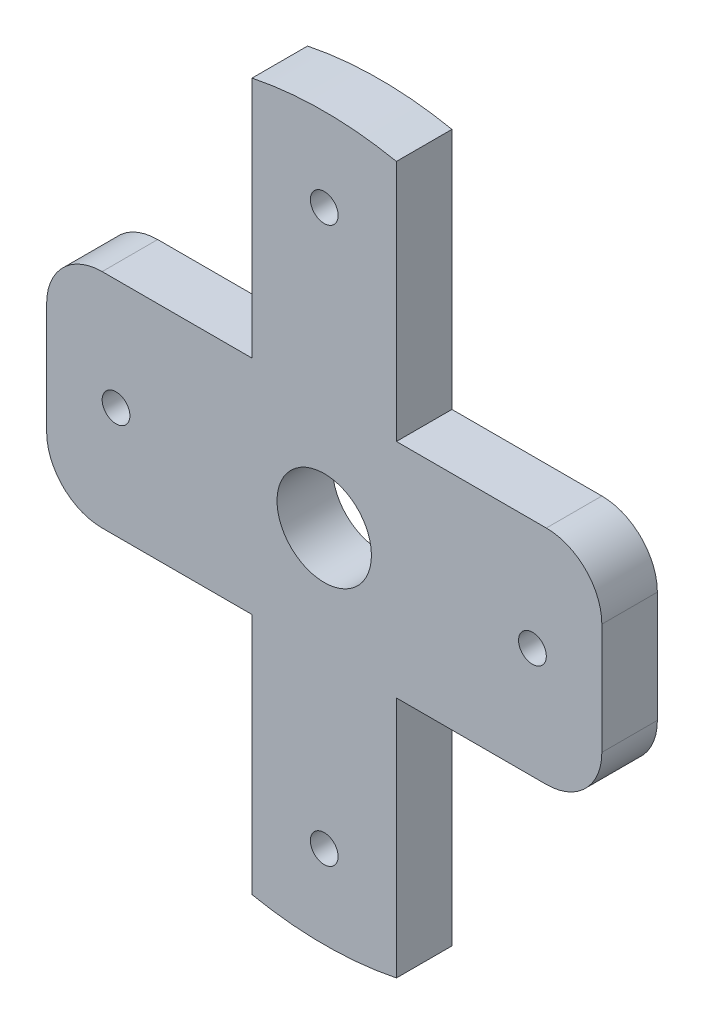
ISO-10303-21;
HEADER;
FILE_DESCRIPTION(('STEP AP214'),'2;1');
FILE_NAME('part.step','',(''),(''),'','','');
FILE_SCHEMA(('AUTOMOTIVE_DESIGN { 1 0 10303 214 1 1 1 1 }'));
ENDSEC;
DATA;
#1=APPLICATION_CONTEXT('core data for automotive mechanical design processes');
#2=APPLICATION_PROTOCOL_DEFINITION('international standard','automotive_design',2000,#1);
#3=PRODUCT_CONTEXT('',#1,'mechanical');
#4=PRODUCT('Part','Part','',(#3));
#5=PRODUCT_RELATED_PRODUCT_CATEGORY('part','',(#4));
#6=PRODUCT_DEFINITION_FORMATION('','',#4);
#7=PRODUCT_DEFINITION_CONTEXT('part definition',#1,'design');
#8=PRODUCT_DEFINITION('design','',#6,#7);
#9=PRODUCT_DEFINITION_SHAPE('','',#8);
#10=(LENGTH_UNIT() NAMED_UNIT(*) SI_UNIT(.MILLI.,.METRE.));
#11=(NAMED_UNIT(*) PLANE_ANGLE_UNIT() SI_UNIT($,.RADIAN.));
#12=(NAMED_UNIT(*) SI_UNIT($,.STERADIAN.) SOLID_ANGLE_UNIT());
#13=UNCERTAINTY_MEASURE_WITH_UNIT(LENGTH_MEASURE(1.E-05),#10,'distance_accuracy_value','');
#14=(GEOMETRIC_REPRESENTATION_CONTEXT(3) GLOBAL_UNCERTAINTY_ASSIGNED_CONTEXT((#13)) GLOBAL_UNIT_ASSIGNED_CONTEXT((#10,
#11,#12)) REPRESENTATION_CONTEXT('',''));
#15=CARTESIAN_POINT('',(0.,0.,0.));
#16=DIRECTION('',(0.,0.,1.));
#17=DIRECTION('',(1.,0.,0.));
#18=AXIS2_PLACEMENT_3D('',#15,#16,#17);
#19=CARTESIAN_POINT('',(0.,0.,10.));
#20=DIRECTION('',(0.,0.,1.));
#21=DIRECTION('',(1.,0.,0.));
#22=AXIS2_PLACEMENT_3D('',#19,#20,#21);
#23=PLANE('',#22);
#24=CARTESIAN_POINT('',(37.5,0.,10.));
#25=DIRECTION('',(0.,0.,1.));
#26=DIRECTION('',(1.,0.,0.));
#27=AXIS2_PLACEMENT_3D('',#24,#25,#26);
#28=CIRCLE('',#27,2.5);
#29=CARTESIAN_POINT('',(40.,0.,10.));
#30=VERTEX_POINT('',#29);
#31=EDGE_CURVE('E347',#30,#30,#28,.T.);
#32=ORIENTED_EDGE('',*,*,#31,.F.);
#33=EDGE_LOOP('',(#32));
#34=FACE_BOUND('',#33,.T.);
#35=CARTESIAN_POINT('',(0.,0.,10.));
#36=DIRECTION('',(0.,0.,1.));
#37=DIRECTION('',(1.,0.,0.));
#38=AXIS2_PLACEMENT_3D('',#35,#36,#37);
#39=CIRCLE('',#38,8.5);
#40=CARTESIAN_POINT('',(8.5,0.,10.));
#41=VERTEX_POINT('',#40);
#42=EDGE_CURVE('E359',#41,#41,#39,.T.);
#43=ORIENTED_EDGE('',*,*,#42,.F.);
#44=EDGE_LOOP('',(#43));
#45=FACE_BOUND('',#44,.T.);
#46=DIRECTION('',(0.,1.,0.));
#47=VECTOR('',#46,1.);
#48=CARTESIAN_POINT('',(13.,20.,10.));
#49=LINE('',#48,#47);
#50=CARTESIAN_POINT('',(13.,20.,10.));
#51=VERTEX_POINT('',#50);
#52=CARTESIAN_POINT('',(13.,63.6867333123626,10.));
#53=VERTEX_POINT('',#52);
#54=EDGE_CURVE('E209',#51,#53,#49,.T.);
#55=ORIENTED_EDGE('',*,*,#54,.T.);
#56=CARTESIAN_POINT('',(0.,0.,10.));
#57=DIRECTION('',(0.,0.,1.));
#58=DIRECTION('',(1.,0.,0.));
#59=AXIS2_PLACEMENT_3D('',#56,#57,#58);
#60=CIRCLE('',#59,65.);
#61=CARTESIAN_POINT('',(-13.,63.6867333123626,10.));
#62=VERTEX_POINT('',#61);
#63=EDGE_CURVE('E117',#53,#62,#60,.T.);
#64=ORIENTED_EDGE('',*,*,#63,.T.);
#65=DIRECTION('',(0.,-1.,0.));
#66=VECTOR('',#65,1.);
#67=CARTESIAN_POINT('',(-13.,20.,10.));
#68=LINE('',#67,#66);
#69=CARTESIAN_POINT('',(-13.,20.,10.));
#70=VERTEX_POINT('',#69);
#71=EDGE_CURVE('E248',#62,#70,#68,.T.);
#72=ORIENTED_EDGE('',*,*,#71,.T.);
#73=DIRECTION('',(-1.,0.,0.));
#74=VECTOR('',#73,1.);
#75=CARTESIAN_POINT('',(-13.,20.,10.));
#76=LINE('',#75,#74);
#77=CARTESIAN_POINT('',(-39.9999999999999,20.,10.));
#78=VERTEX_POINT('',#77);
#79=EDGE_CURVE('E267',#70,#78,#76,.T.);
#80=ORIENTED_EDGE('',*,*,#79,.T.);
#81=CARTESIAN_POINT('',(-40.,9.99999999999998,10.));
#82=DIRECTION('',(0.,0.,1.));
#83=DIRECTION('',(1.,0.,0.));
#84=AXIS2_PLACEMENT_3D('',#81,#82,#83);
#85=CIRCLE('',#84,10.);
#86=CARTESIAN_POINT('',(-50.,9.99999999999991,10.));
#87=VERTEX_POINT('',#86);
#88=EDGE_CURVE('E264',#78,#87,#85,.T.);
#89=ORIENTED_EDGE('',*,*,#88,.T.);
#90=DIRECTION('',(0.,-1.,0.));
#91=VECTOR('',#90,1.);
#92=CARTESIAN_POINT('',(-50.,9.99999999999991,10.));
#93=LINE('',#92,#91);
#94=CARTESIAN_POINT('',(-50.,-9.99999999999993,10.));
#95=VERTEX_POINT('',#94);
#96=EDGE_CURVE('E266',#87,#95,#93,.T.);
#97=ORIENTED_EDGE('',*,*,#96,.T.);
#98=CARTESIAN_POINT('',(-40.,-10.,10.));
#99=DIRECTION('',(0.,0.,1.));
#100=DIRECTION('',(1.,0.,0.));
#101=AXIS2_PLACEMENT_3D('',#98,#99,#100);
#102=CIRCLE('',#101,9.99999999999999);
#103=CARTESIAN_POINT('',(-39.9999999999999,-20.,10.));
#104=VERTEX_POINT('',#103);
#105=EDGE_CURVE('E269',#95,#104,#102,.T.);
#106=ORIENTED_EDGE('',*,*,#105,.T.);
#107=DIRECTION('',(1.,0.,0.));
#108=VECTOR('',#107,1.);
#109=CARTESIAN_POINT('',(-39.9999999999999,-20.,10.));
#110=LINE('',#109,#108);
#111=CARTESIAN_POINT('',(-13.,-20.,10.));
#112=VERTEX_POINT('',#111);
#113=EDGE_CURVE('E275',#104,#112,#110,.T.);
#114=ORIENTED_EDGE('',*,*,#113,.T.);
#115=DIRECTION('',(0.,-1.,0.));
#116=VECTOR('',#115,1.);
#117=CARTESIAN_POINT('',(-13.,-20.,10.));
#118=LINE('',#117,#116);
#119=CARTESIAN_POINT('',(-13.,-63.6867333123626,10.));
#120=VERTEX_POINT('',#119);
#121=EDGE_CURVE('E277',#112,#120,#118,.T.);
#122=ORIENTED_EDGE('',*,*,#121,.T.);
#123=CARTESIAN_POINT('',(0.,0.,10.));
#124=DIRECTION('',(0.,0.,1.));
#125=DIRECTION('',(1.,0.,0.));
#126=AXIS2_PLACEMENT_3D('',#123,#124,#125);
#127=CIRCLE('',#126,65.);
#128=CARTESIAN_POINT('',(13.,-63.6867333123626,10.));
#129=VERTEX_POINT('',#128);
#130=EDGE_CURVE('E279',#120,#129,#127,.T.);
#131=ORIENTED_EDGE('',*,*,#130,.T.);
#132=DIRECTION('',(0.,1.,0.));
#133=VECTOR('',#132,1.);
#134=CARTESIAN_POINT('',(13.,-20.,10.));
#135=LINE('',#134,#133);
#136=CARTESIAN_POINT('',(13.,-20.,10.));
#137=VERTEX_POINT('',#136);
#138=EDGE_CURVE('E281',#129,#137,#135,.T.);
#139=ORIENTED_EDGE('',*,*,#138,.T.);
#140=DIRECTION('',(1.,0.,0.));
#141=VECTOR('',#140,1.);
#142=CARTESIAN_POINT('',(13.,-20.,10.));
#143=LINE('',#142,#141);
#144=CARTESIAN_POINT('',(39.9999999999999,-20.,10.));
#145=VERTEX_POINT('',#144);
#146=EDGE_CURVE('E283',#137,#145,#143,.T.);
#147=ORIENTED_EDGE('',*,*,#146,.T.);
#148=CARTESIAN_POINT('',(40.,-9.99999999999999,10.));
#149=DIRECTION('',(0.,0.,1.));
#150=DIRECTION('',(-1.,0.,0.));
#151=AXIS2_PLACEMENT_3D('',#148,#149,#150);
#152=CIRCLE('',#151,10.);
#153=CARTESIAN_POINT('',(50.,-9.99999999999992,10.));
#154=VERTEX_POINT('',#153);
#155=EDGE_CURVE('E160',#145,#154,#152,.T.);
#156=ORIENTED_EDGE('',*,*,#155,.T.);
#157=DIRECTION('',(0.,1.,0.));
#158=VECTOR('',#157,1.);
#159=CARTESIAN_POINT('',(50.,9.99999999999992,10.));
#160=LINE('',#159,#158);
#161=CARTESIAN_POINT('',(50.,9.99999999999992,10.));
#162=VERTEX_POINT('',#161);
#163=EDGE_CURVE('E154',#154,#162,#160,.T.);
#164=ORIENTED_EDGE('',*,*,#163,.T.);
#165=CARTESIAN_POINT('',(40.,9.99999999999999,10.));
#166=DIRECTION('',(0.,0.,1.));
#167=DIRECTION('',(-1.,0.,0.));
#168=AXIS2_PLACEMENT_3D('',#165,#166,#167);
#169=CIRCLE('',#168,10.);
#170=CARTESIAN_POINT('',(39.9999999999999,20.,10.));
#171=VERTEX_POINT('',#170);
#172=EDGE_CURVE('E158',#162,#171,#169,.T.);
#173=ORIENTED_EDGE('',*,*,#172,.T.);
#174=DIRECTION('',(-1.,0.,0.));
#175=VECTOR('',#174,1.);
#176=CARTESIAN_POINT('',(13.,20.,10.));
#177=LINE('',#176,#175);
#178=EDGE_CURVE('E50',#171,#51,#177,.T.);
#179=ORIENTED_EDGE('',*,*,#178,.T.);
#180=EDGE_LOOP('',(#55,#64,#72,#80,#89,#97,#106,#114,#122,#131,#139,#147,#156,#164,#173,#179));
#181=FACE_BOUND('',#180,.T.);
#182=CARTESIAN_POINT('',(-37.5,0.,10.));
#183=DIRECTION('',(0.,0.,1.));
#184=DIRECTION('',(1.,0.,0.));
#185=AXIS2_PLACEMENT_3D('',#182,#183,#184);
#186=CIRCLE('',#185,2.5);
#187=CARTESIAN_POINT('',(-35.,0.,10.));
#188=VERTEX_POINT('',#187);
#189=EDGE_CURVE('E182',#188,#188,#186,.T.);
#190=ORIENTED_EDGE('',*,*,#189,.F.);
#191=EDGE_LOOP('',(#190));
#192=FACE_BOUND('',#191,.T.);
#193=CARTESIAN_POINT('',(0.,-50.,10.));
#194=DIRECTION('',(0.,0.,1.));
#195=DIRECTION('',(1.,0.,0.));
#196=AXIS2_PLACEMENT_3D('',#193,#194,#195);
#197=CIRCLE('',#196,2.5);
#198=CARTESIAN_POINT('',(2.50000000000001,-50.,10.));
#199=VERTEX_POINT('',#198);
#200=EDGE_CURVE('E353',#199,#199,#197,.T.);
#201=ORIENTED_EDGE('',*,*,#200,.F.);
#202=EDGE_LOOP('',(#201));
#203=FACE_BOUND('',#202,.T.);
#204=CARTESIAN_POINT('',(0.,50.,10.));
#205=DIRECTION('',(0.,0.,1.));
#206=DIRECTION('',(1.,0.,0.));
#207=AXIS2_PLACEMENT_3D('',#204,#205,#206);
#208=CIRCLE('',#207,2.5);
#209=CARTESIAN_POINT('',(2.5,50.,10.));
#210=VERTEX_POINT('',#209);
#211=EDGE_CURVE('E338',#210,#210,#208,.T.);
#212=ORIENTED_EDGE('',*,*,#211,.F.);
#213=EDGE_LOOP('',(#212));
#214=FACE_BOUND('',#213,.T.);
#215=ADVANCED_FACE('F33',(#34,#45,#181,#192,#203,#214),#23,.T.);
#216=CARTESIAN_POINT('',(0.,0.,0.));
#217=DIRECTION('',(0.,0.,1.));
#218=DIRECTION('',(1.,0.,0.));
#219=AXIS2_PLACEMENT_3D('',#216,#217,#218);
#220=PLANE('',#219);
#221=DIRECTION('',(0.,1.,0.));
#222=VECTOR('',#221,1.);
#223=CARTESIAN_POINT('',(13.,20.,0.));
#224=LINE('',#223,#222);
#225=CARTESIAN_POINT('',(13.,20.,0.));
#226=VERTEX_POINT('',#225);
#227=CARTESIAN_POINT('',(13.,63.6867333123626,0.));
#228=VERTEX_POINT('',#227);
#229=EDGE_CURVE('E178',#226,#228,#224,.T.);
#230=ORIENTED_EDGE('',*,*,#229,.F.);
#231=DIRECTION('',(-1.,0.,0.));
#232=VECTOR('',#231,1.);
#233=CARTESIAN_POINT('',(13.,20.,0.));
#234=LINE('',#233,#232);
#235=CARTESIAN_POINT('',(39.9999999999999,20.,0.));
#236=VERTEX_POINT('',#235);
#237=EDGE_CURVE('E109',#236,#226,#234,.T.);
#238=ORIENTED_EDGE('',*,*,#237,.F.);
#239=CARTESIAN_POINT('',(40.,9.99999999999999,0.));
#240=DIRECTION('',(0.,0.,1.));
#241=DIRECTION('',(-1.,0.,0.));
#242=AXIS2_PLACEMENT_3D('',#239,#240,#241);
#243=CIRCLE('',#242,10.);
#244=CARTESIAN_POINT('',(50.,9.99999999999992,0.));
#245=VERTEX_POINT('',#244);
#246=EDGE_CURVE('E103',#245,#236,#243,.T.);
#247=ORIENTED_EDGE('',*,*,#246,.F.);
#248=DIRECTION('',(0.,1.,0.));
#249=VECTOR('',#248,1.);
#250=CARTESIAN_POINT('',(50.,9.99999999999992,0.));
#251=LINE('',#250,#249);
#252=CARTESIAN_POINT('',(50.,-9.99999999999992,0.));
#253=VERTEX_POINT('',#252);
#254=EDGE_CURVE('E168',#253,#245,#251,.T.);
#255=ORIENTED_EDGE('',*,*,#254,.F.);
#256=CARTESIAN_POINT('',(40.,-9.99999999999999,0.));
#257=DIRECTION('',(0.,0.,1.));
#258=DIRECTION('',(-1.,0.,0.));
#259=AXIS2_PLACEMENT_3D('',#256,#257,#258);
#260=CIRCLE('',#259,10.);
#261=CARTESIAN_POINT('',(39.9999999999999,-20.,0.));
#262=VERTEX_POINT('',#261);
#263=EDGE_CURVE('E204',#262,#253,#260,.T.);
#264=ORIENTED_EDGE('',*,*,#263,.F.);
#265=DIRECTION('',(1.,0.,0.));
#266=VECTOR('',#265,1.);
#267=CARTESIAN_POINT('',(13.,-20.,0.));
#268=LINE('',#267,#266);
#269=CARTESIAN_POINT('',(13.,-20.,0.));
#270=VERTEX_POINT('',#269);
#271=EDGE_CURVE('E202',#270,#262,#268,.T.);
#272=ORIENTED_EDGE('',*,*,#271,.F.);
#273=DIRECTION('',(0.,1.,0.));
#274=VECTOR('',#273,1.);
#275=CARTESIAN_POINT('',(13.,-20.,0.));
#276=LINE('',#275,#274);
#277=CARTESIAN_POINT('',(13.,-63.6867333123626,0.));
#278=VERTEX_POINT('',#277);
#279=EDGE_CURVE('E200',#278,#270,#276,.T.);
#280=ORIENTED_EDGE('',*,*,#279,.F.);
#281=CARTESIAN_POINT('',(0.,0.,0.));
#282=DIRECTION('',(0.,0.,1.));
#283=DIRECTION('',(1.,0.,0.));
#284=AXIS2_PLACEMENT_3D('',#281,#282,#283);
#285=CIRCLE('',#284,65.);
#286=CARTESIAN_POINT('',(-13.,-63.6867333123626,0.));
#287=VERTEX_POINT('',#286);
#288=EDGE_CURVE('E198',#287,#278,#285,.T.);
#289=ORIENTED_EDGE('',*,*,#288,.F.);
#290=DIRECTION('',(0.,-1.,0.));
#291=VECTOR('',#290,1.);
#292=CARTESIAN_POINT('',(-13.,-20.,0.));
#293=LINE('',#292,#291);
#294=CARTESIAN_POINT('',(-13.,-20.,0.));
#295=VERTEX_POINT('',#294);
#296=EDGE_CURVE('E196',#295,#287,#293,.T.);
#297=ORIENTED_EDGE('',*,*,#296,.F.);
#298=DIRECTION('',(1.,0.,0.));
#299=VECTOR('',#298,1.);
#300=CARTESIAN_POINT('',(-39.9999999999999,-20.,0.));
#301=LINE('',#300,#299);
#302=CARTESIAN_POINT('',(-39.9999999999999,-20.,0.));
#303=VERTEX_POINT('',#302);
#304=EDGE_CURVE('E194',#303,#295,#301,.T.);
#305=ORIENTED_EDGE('',*,*,#304,.F.);
#306=CARTESIAN_POINT('',(-40.,-10.,0.));
#307=DIRECTION('',(0.,0.,1.));
#308=DIRECTION('',(1.,0.,0.));
#309=AXIS2_PLACEMENT_3D('',#306,#307,#308);
#310=CIRCLE('',#309,9.99999999999999);
#311=CARTESIAN_POINT('',(-50.,-9.99999999999993,0.));
#312=VERTEX_POINT('',#311);
#313=EDGE_CURVE('E192',#312,#303,#310,.T.);
#314=ORIENTED_EDGE('',*,*,#313,.F.);
#315=DIRECTION('',(0.,-1.,0.));
#316=VECTOR('',#315,1.);
#317=CARTESIAN_POINT('',(-50.,9.99999999999991,0.));
#318=LINE('',#317,#316);
#319=CARTESIAN_POINT('',(-50.,9.99999999999991,0.));
#320=VERTEX_POINT('',#319);
#321=EDGE_CURVE('E190',#320,#312,#318,.T.);
#322=ORIENTED_EDGE('',*,*,#321,.F.);
#323=CARTESIAN_POINT('',(-40.,9.99999999999998,0.));
#324=DIRECTION('',(0.,0.,1.));
#325=DIRECTION('',(1.,0.,0.));
#326=AXIS2_PLACEMENT_3D('',#323,#324,#325);
#327=CIRCLE('',#326,10.);
#328=CARTESIAN_POINT('',(-39.9999999999999,20.,0.));
#329=VERTEX_POINT('',#328);
#330=EDGE_CURVE('E188',#329,#320,#327,.T.);
#331=ORIENTED_EDGE('',*,*,#330,.F.);
#332=DIRECTION('',(-1.,0.,0.));
#333=VECTOR('',#332,1.);
#334=CARTESIAN_POINT('',(-13.,20.,0.));
#335=LINE('',#334,#333);
#336=CARTESIAN_POINT('',(-13.,20.,0.));
#337=VERTEX_POINT('',#336);
#338=EDGE_CURVE('E186',#337,#329,#335,.T.);
#339=ORIENTED_EDGE('',*,*,#338,.F.);
#340=DIRECTION('',(0.,-1.,0.));
#341=VECTOR('',#340,1.);
#342=CARTESIAN_POINT('',(-13.,20.,0.));
#343=LINE('',#342,#341);
#344=CARTESIAN_POINT('',(-13.,63.6867333123626,0.));
#345=VERTEX_POINT('',#344);
#346=EDGE_CURVE('E184',#345,#337,#343,.T.);
#347=ORIENTED_EDGE('',*,*,#346,.F.);
#348=CARTESIAN_POINT('',(0.,0.,0.));
#349=DIRECTION('',(0.,0.,1.));
#350=DIRECTION('',(1.,0.,0.));
#351=AXIS2_PLACEMENT_3D('',#348,#349,#350);
#352=CIRCLE('',#351,65.);
#353=EDGE_CURVE('E181',#228,#345,#352,.T.);
#354=ORIENTED_EDGE('',*,*,#353,.F.);
#355=EDGE_LOOP('',(#230,#238,#247,#255,#264,#272,#280,#289,#297,#305,#314,#322,#331,#339,#347,#354));
#356=FACE_BOUND('',#355,.T.);
#357=CARTESIAN_POINT('',(-37.5,0.,0.));
#358=DIRECTION('',(0.,0.,1.));
#359=DIRECTION('',(1.,0.,0.));
#360=AXIS2_PLACEMENT_3D('',#357,#358,#359);
#361=CIRCLE('',#360,2.5);
#362=CARTESIAN_POINT('',(-35.,0.,0.));
#363=VERTEX_POINT('',#362);
#364=EDGE_CURVE('E362',#363,#363,#361,.T.);
#365=ORIENTED_EDGE('',*,*,#364,.T.);
#366=EDGE_LOOP('',(#365));
#367=FACE_BOUND('',#366,.T.);
#368=CARTESIAN_POINT('',(0.,0.,0.));
#369=DIRECTION('',(0.,0.,1.));
#370=DIRECTION('',(1.,0.,0.));
#371=AXIS2_PLACEMENT_3D('',#368,#369,#370);
#372=CIRCLE('',#371,8.5);
#373=CARTESIAN_POINT('',(8.5,0.,0.));
#374=VERTEX_POINT('',#373);
#375=EDGE_CURVE('E356',#374,#374,#372,.T.);
#376=ORIENTED_EDGE('',*,*,#375,.T.);
#377=EDGE_LOOP('',(#376));
#378=FACE_BOUND('',#377,.T.);
#379=CARTESIAN_POINT('',(0.,-50.,0.));
#380=DIRECTION('',(0.,0.,1.));
#381=DIRECTION('',(1.,0.,0.));
#382=AXIS2_PLACEMENT_3D('',#379,#380,#381);
#383=CIRCLE('',#382,2.5);
#384=CARTESIAN_POINT('',(2.50000000000001,-50.,0.));
#385=VERTEX_POINT('',#384);
#386=EDGE_CURVE('E350',#385,#385,#383,.T.);
#387=ORIENTED_EDGE('',*,*,#386,.T.);
#388=EDGE_LOOP('',(#387));
#389=FACE_BOUND('',#388,.T.);
#390=CARTESIAN_POINT('',(37.5,0.,0.));
#391=DIRECTION('',(0.,0.,1.));
#392=DIRECTION('',(1.,0.,0.));
#393=AXIS2_PLACEMENT_3D('',#390,#391,#392);
#394=CIRCLE('',#393,2.5);
#395=CARTESIAN_POINT('',(40.,0.,0.));
#396=VERTEX_POINT('',#395);
#397=EDGE_CURVE('E344',#396,#396,#394,.T.);
#398=ORIENTED_EDGE('',*,*,#397,.T.);
#399=EDGE_LOOP('',(#398));
#400=FACE_BOUND('',#399,.T.);
#401=CARTESIAN_POINT('',(0.,50.,0.));
#402=DIRECTION('',(0.,0.,1.));
#403=DIRECTION('',(1.,0.,0.));
#404=AXIS2_PLACEMENT_3D('',#401,#402,#403);
#405=CIRCLE('',#404,2.5);
#406=CARTESIAN_POINT('',(2.5,50.,0.));
#407=VERTEX_POINT('',#406);
#408=EDGE_CURVE('E341',#407,#407,#405,.T.);
#409=ORIENTED_EDGE('',*,*,#408,.T.);
#410=EDGE_LOOP('',(#409));
#411=FACE_BOUND('',#410,.T.);
#412=ADVANCED_FACE('F252',(#356,#367,#378,#389,#400,#411),#220,.F.);
#413=CARTESIAN_POINT('',(13.,20.,10.));
#414=DIRECTION('',(-1.,0.,0.));
#415=DIRECTION('',(0.,0.,1.));
#416=AXIS2_PLACEMENT_3D('',#413,#414,#415);
#417=PLANE('',#416);
#418=ORIENTED_EDGE('',*,*,#229,.T.);
#419=DIRECTION('',(0.,0.,-1.));
#420=VECTOR('',#419,1.);
#421=CARTESIAN_POINT('',(13.,63.6867333123626,10.));
#422=LINE('',#421,#420);
#423=EDGE_CURVE('E11',#53,#228,#422,.T.);
#424=ORIENTED_EDGE('',*,*,#423,.F.);
#425=ORIENTED_EDGE('',*,*,#54,.F.);
#426=DIRECTION('',(0.,0.,-1.));
#427=VECTOR('',#426,1.);
#428=CARTESIAN_POINT('',(13.,20.,10.));
#429=LINE('',#428,#427);
#430=EDGE_CURVE('E174',#51,#226,#429,.T.);
#431=ORIENTED_EDGE('',*,*,#430,.T.);
#432=EDGE_LOOP('',(#418,#424,#425,#431));
#433=FACE_BOUND('',#432,.T.);
#434=ADVANCED_FACE('F35',(#433),#417,.F.);
#435=CARTESIAN_POINT('',(0.,0.,10.));
#436=DIRECTION('',(0.,0.,-1.));
#437=DIRECTION('',(-1.,0.,0.));
#438=AXIS2_PLACEMENT_3D('',#435,#436,#437);
#439=CYLINDRICAL_SURFACE('',#438,65.);
#440=ORIENTED_EDGE('',*,*,#353,.T.);
#441=DIRECTION('',(0.,0.,-1.));
#442=VECTOR('',#441,1.);
#443=CARTESIAN_POINT('',(-13.,63.6867333123626,10.));
#444=LINE('',#443,#442);
#445=EDGE_CURVE('E42',#62,#345,#444,.T.);
#446=ORIENTED_EDGE('',*,*,#445,.F.);
#447=ORIENTED_EDGE('',*,*,#63,.F.);
#448=ORIENTED_EDGE('',*,*,#423,.T.);
#449=EDGE_LOOP('',(#440,#446,#447,#448));
#450=FACE_BOUND('',#449,.T.);
#451=ADVANCED_FACE('F521',(#450),#439,.T.);
#452=CARTESIAN_POINT('',(-13.,20.,10.));
#453=DIRECTION('',(1.,0.,0.));
#454=DIRECTION('',(0.,0.,-1.));
#455=AXIS2_PLACEMENT_3D('',#452,#453,#454);
#456=PLANE('',#455);
#457=ORIENTED_EDGE('',*,*,#346,.T.);
#458=DIRECTION('',(0.,0.,-1.));
#459=VECTOR('',#458,1.);
#460=CARTESIAN_POINT('',(-13.,20.,10.));
#461=LINE('',#460,#459);
#462=EDGE_CURVE('E240',#70,#337,#461,.T.);
#463=ORIENTED_EDGE('',*,*,#462,.F.);
#464=ORIENTED_EDGE('',*,*,#71,.F.);
#465=ORIENTED_EDGE('',*,*,#445,.T.);
#466=EDGE_LOOP('',(#457,#463,#464,#465));
#467=FACE_BOUND('',#466,.T.);
#468=ADVANCED_FACE('F246',(#467),#456,.F.);
#469=CARTESIAN_POINT('',(-13.,20.,10.));
#470=DIRECTION('',(0.,-1.,0.));
#471=DIRECTION('',(1.,0.,0.));
#472=AXIS2_PLACEMENT_3D('',#469,#470,#471);
#473=PLANE('',#472);
#474=ORIENTED_EDGE('',*,*,#338,.T.);
#475=DIRECTION('',(0.,0.,-1.));
#476=VECTOR('',#475,1.);
#477=CARTESIAN_POINT('',(-39.9999999999999,20.,10.));
#478=LINE('',#477,#476);
#479=EDGE_CURVE('E237',#78,#329,#478,.T.);
#480=ORIENTED_EDGE('',*,*,#479,.F.);
#481=ORIENTED_EDGE('',*,*,#79,.F.);
#482=ORIENTED_EDGE('',*,*,#462,.T.);
#483=EDGE_LOOP('',(#474,#480,#481,#482));
#484=FACE_BOUND('',#483,.T.);
#485=ADVANCED_FACE('F258',(#484),#473,.F.);
#486=CARTESIAN_POINT('',(-40.,9.99999999999998,10.));
#487=DIRECTION('',(0.,0.,-1.));
#488=DIRECTION('',(-1.,0.,0.));
#489=AXIS2_PLACEMENT_3D('',#486,#487,#488);
#490=CYLINDRICAL_SURFACE('',#489,10.);
#491=ORIENTED_EDGE('',*,*,#330,.T.);
#492=DIRECTION('',(0.,0.,-1.));
#493=VECTOR('',#492,1.);
#494=CARTESIAN_POINT('',(-50.,9.99999999999991,10.));
#495=LINE('',#494,#493);
#496=EDGE_CURVE('E234',#87,#320,#495,.T.);
#497=ORIENTED_EDGE('',*,*,#496,.F.);
#498=ORIENTED_EDGE('',*,*,#88,.F.);
#499=ORIENTED_EDGE('',*,*,#479,.T.);
#500=EDGE_LOOP('',(#491,#497,#498,#499));
#501=FACE_BOUND('',#500,.T.);
#502=ADVANCED_FACE('F262',(#501),#490,.T.);
#503=CARTESIAN_POINT('',(-50.,9.99999999999991,10.));
#504=DIRECTION('',(1.,0.,0.));
#505=DIRECTION('',(0.,1.,0.));
#506=AXIS2_PLACEMENT_3D('',#503,#504,#505);
#507=PLANE('',#506);
#508=ORIENTED_EDGE('',*,*,#321,.T.);
#509=DIRECTION('',(0.,0.,-1.));
#510=VECTOR('',#509,1.);
#511=CARTESIAN_POINT('',(-50.,-9.99999999999993,10.));
#512=LINE('',#511,#510);
#513=EDGE_CURVE('E231',#95,#312,#512,.T.);
#514=ORIENTED_EDGE('',*,*,#513,.F.);
#515=ORIENTED_EDGE('',*,*,#96,.F.);
#516=ORIENTED_EDGE('',*,*,#496,.T.);
#517=EDGE_LOOP('',(#508,#514,#515,#516));
#518=FACE_BOUND('',#517,.T.);
#519=ADVANCED_FACE('F486',(#518),#507,.F.);
#520=CARTESIAN_POINT('',(-40.,-10.,10.));
#521=DIRECTION('',(0.,0.,-1.));
#522=DIRECTION('',(-1.,0.,0.));
#523=AXIS2_PLACEMENT_3D('',#520,#521,#522);
#524=CYLINDRICAL_SURFACE('',#523,9.99999999999999);
#525=ORIENTED_EDGE('',*,*,#313,.T.);
#526=DIRECTION('',(0.,0.,-1.));
#527=VECTOR('',#526,1.);
#528=CARTESIAN_POINT('',(-39.9999999999999,-20.,10.));
#529=LINE('',#528,#527);
#530=EDGE_CURVE('E228',#104,#303,#529,.T.);
#531=ORIENTED_EDGE('',*,*,#530,.F.);
#532=ORIENTED_EDGE('',*,*,#105,.F.);
#533=ORIENTED_EDGE('',*,*,#513,.T.);
#534=EDGE_LOOP('',(#525,#531,#532,#533));
#535=FACE_BOUND('',#534,.T.);
#536=ADVANCED_FACE('F476',(#535),#524,.T.);
#537=CARTESIAN_POINT('',(-39.9999999999999,-20.,10.));
#538=DIRECTION('',(0.,1.,0.));
#539=DIRECTION('',(-1.,0.,0.));
#540=AXIS2_PLACEMENT_3D('',#537,#538,#539);
#541=PLANE('',#540);
#542=ORIENTED_EDGE('',*,*,#304,.T.);
#543=DIRECTION('',(0.,0.,-1.));
#544=VECTOR('',#543,1.);
#545=CARTESIAN_POINT('',(-13.,-20.,10.));
#546=LINE('',#545,#544);
#547=EDGE_CURVE('E225',#112,#295,#546,.T.);
#548=ORIENTED_EDGE('',*,*,#547,.F.);
#549=ORIENTED_EDGE('',*,*,#113,.F.);
#550=ORIENTED_EDGE('',*,*,#530,.T.);
#551=EDGE_LOOP('',(#542,#548,#549,#550));
#552=FACE_BOUND('',#551,.T.);
#553=ADVANCED_FACE('F466',(#552),#541,.F.);
#554=CARTESIAN_POINT('',(-13.,-20.,10.));
#555=DIRECTION('',(1.,0.,0.));
#556=DIRECTION('',(0.,0.,-1.));
#557=AXIS2_PLACEMENT_3D('',#554,#555,#556);
#558=PLANE('',#557);
#559=ORIENTED_EDGE('',*,*,#296,.T.);
#560=DIRECTION('',(0.,0.,-1.));
#561=VECTOR('',#560,1.);
#562=CARTESIAN_POINT('',(-13.,-63.6867333123626,10.));
#563=LINE('',#562,#561);
#564=EDGE_CURVE('E222',#120,#287,#563,.T.);
#565=ORIENTED_EDGE('',*,*,#564,.F.);
#566=ORIENTED_EDGE('',*,*,#121,.F.);
#567=ORIENTED_EDGE('',*,*,#547,.T.);
#568=EDGE_LOOP('',(#559,#565,#566,#567));
#569=FACE_BOUND('',#568,.T.);
#570=ADVANCED_FACE('F456',(#569),#558,.F.);
#571=CARTESIAN_POINT('',(0.,0.,10.));
#572=DIRECTION('',(0.,0.,-1.));
#573=DIRECTION('',(-1.,0.,0.));
#574=AXIS2_PLACEMENT_3D('',#571,#572,#573);
#575=CYLINDRICAL_SURFACE('',#574,65.);
#576=ORIENTED_EDGE('',*,*,#288,.T.);
#577=DIRECTION('',(0.,0.,-1.));
#578=VECTOR('',#577,1.);
#579=CARTESIAN_POINT('',(13.,-63.6867333123626,10.));
#580=LINE('',#579,#578);
#581=EDGE_CURVE('E219',#129,#278,#580,.T.);
#582=ORIENTED_EDGE('',*,*,#581,.F.);
#583=ORIENTED_EDGE('',*,*,#130,.F.);
#584=ORIENTED_EDGE('',*,*,#564,.T.);
#585=EDGE_LOOP('',(#576,#582,#583,#584));
#586=FACE_BOUND('',#585,.T.);
#587=ADVANCED_FACE('F446',(#586),#575,.T.);
#588=CARTESIAN_POINT('',(13.,-20.,10.));
#589=DIRECTION('',(-1.,0.,0.));
#590=DIRECTION('',(0.,0.,1.));
#591=AXIS2_PLACEMENT_3D('',#588,#589,#590);
#592=PLANE('',#591);
#593=ORIENTED_EDGE('',*,*,#279,.T.);
#594=DIRECTION('',(0.,0.,-1.));
#595=VECTOR('',#594,1.);
#596=CARTESIAN_POINT('',(13.,-20.,10.));
#597=LINE('',#596,#595);
#598=EDGE_CURVE('E216',#137,#270,#597,.T.);
#599=ORIENTED_EDGE('',*,*,#598,.F.);
#600=ORIENTED_EDGE('',*,*,#138,.F.);
#601=ORIENTED_EDGE('',*,*,#581,.T.);
#602=EDGE_LOOP('',(#593,#599,#600,#601));
#603=FACE_BOUND('',#602,.T.);
#604=ADVANCED_FACE('F437',(#603),#592,.F.);
#605=CARTESIAN_POINT('',(13.,-20.,10.));
#606=DIRECTION('',(0.,1.,0.));
#607=DIRECTION('',(0.,0.,1.));
#608=AXIS2_PLACEMENT_3D('',#605,#606,#607);
#609=PLANE('',#608);
#610=ORIENTED_EDGE('',*,*,#271,.T.);
#611=DIRECTION('',(0.,0.,-1.));
#612=VECTOR('',#611,1.);
#613=CARTESIAN_POINT('',(39.9999999999999,-20.,10.));
#614=LINE('',#613,#612);
#615=EDGE_CURVE('E213',#145,#262,#614,.T.);
#616=ORIENTED_EDGE('',*,*,#615,.F.);
#617=ORIENTED_EDGE('',*,*,#146,.F.);
#618=ORIENTED_EDGE('',*,*,#598,.T.);
#619=EDGE_LOOP('',(#610,#616,#617,#618));
#620=FACE_BOUND('',#619,.T.);
#621=ADVANCED_FACE('F289',(#620),#609,.F.);
#622=CARTESIAN_POINT('',(40.,-9.99999999999999,10.));
#623=DIRECTION('',(0.,0.,-1.));
#624=DIRECTION('',(-1.,0.,0.));
#625=AXIS2_PLACEMENT_3D('',#622,#623,#624);
#626=CYLINDRICAL_SURFACE('',#625,10.);
#627=ORIENTED_EDGE('',*,*,#263,.T.);
#628=DIRECTION('',(0.,0.,-1.));
#629=VECTOR('',#628,1.);
#630=CARTESIAN_POINT('',(50.,-9.99999999999992,10.));
#631=LINE('',#630,#629);
#632=EDGE_CURVE('E169',#154,#253,#631,.T.);
#633=ORIENTED_EDGE('',*,*,#632,.F.);
#634=ORIENTED_EDGE('',*,*,#155,.F.);
#635=ORIENTED_EDGE('',*,*,#615,.T.);
#636=EDGE_LOOP('',(#627,#633,#634,#635));
#637=FACE_BOUND('',#636,.T.);
#638=ADVANCED_FACE('F293',(#637),#626,.T.);
#639=CARTESIAN_POINT('',(50.,9.99999999999992,10.));
#640=DIRECTION('',(-1.,0.,0.));
#641=DIRECTION('',(0.,0.,1.));
#642=AXIS2_PLACEMENT_3D('',#639,#640,#641);
#643=PLANE('',#642);
#644=ORIENTED_EDGE('',*,*,#254,.T.);
#645=DIRECTION('',(0.,0.,-1.));
#646=VECTOR('',#645,1.);
#647=CARTESIAN_POINT('',(50.,9.99999999999992,10.));
#648=LINE('',#647,#646);
#649=EDGE_CURVE('E165',#162,#245,#648,.T.);
#650=ORIENTED_EDGE('',*,*,#649,.F.);
#651=ORIENTED_EDGE('',*,*,#163,.F.);
#652=ORIENTED_EDGE('',*,*,#632,.T.);
#653=EDGE_LOOP('',(#644,#650,#651,#652));
#654=FACE_BOUND('',#653,.T.);
#655=ADVANCED_FACE('F166',(#654),#643,.F.);
#656=CARTESIAN_POINT('',(40.,9.99999999999999,10.));
#657=DIRECTION('',(0.,0.,-1.));
#658=DIRECTION('',(-1.,0.,0.));
#659=AXIS2_PLACEMENT_3D('',#656,#657,#658);
#660=CYLINDRICAL_SURFACE('',#659,10.);
#661=ORIENTED_EDGE('',*,*,#246,.T.);
#662=DIRECTION('',(0.,0.,-1.));
#663=VECTOR('',#662,1.);
#664=CARTESIAN_POINT('',(39.9999999999999,20.,10.));
#665=LINE('',#664,#663);
#666=EDGE_CURVE('E170',#171,#236,#665,.T.);
#667=ORIENTED_EDGE('',*,*,#666,.F.);
#668=ORIENTED_EDGE('',*,*,#172,.F.);
#669=ORIENTED_EDGE('',*,*,#649,.T.);
#670=EDGE_LOOP('',(#661,#667,#668,#669));
#671=FACE_BOUND('',#670,.T.);
#672=ADVANCED_FACE('F172',(#671),#660,.T.);
#673=CARTESIAN_POINT('',(13.,20.,10.));
#674=DIRECTION('',(0.,-1.,0.));
#675=DIRECTION('',(0.,0.,-1.));
#676=AXIS2_PLACEMENT_3D('',#673,#674,#675);
#677=PLANE('',#676);
#678=ORIENTED_EDGE('',*,*,#237,.T.);
#679=ORIENTED_EDGE('',*,*,#430,.F.);
#680=ORIENTED_EDGE('',*,*,#178,.F.);
#681=ORIENTED_EDGE('',*,*,#666,.T.);
#682=EDGE_LOOP('',(#678,#679,#680,#681));
#683=FACE_BOUND('',#682,.T.);
#684=ADVANCED_FACE('F297',(#683),#677,.F.);
#685=CARTESIAN_POINT('',(-37.5,0.,10.));
#686=DIRECTION('',(0.,0.,-1.));
#687=DIRECTION('',(-1.,0.,0.));
#688=AXIS2_PLACEMENT_3D('',#685,#686,#687);
#689=CYLINDRICAL_SURFACE('',#688,2.5);
#690=ORIENTED_EDGE('',*,*,#189,.T.);
#691=EDGE_LOOP('',(#690));
#692=FACE_BOUND('',#691,.T.);
#693=ORIENTED_EDGE('',*,*,#364,.F.);
#694=EDGE_LOOP('',(#693));
#695=FACE_BOUND('',#694,.T.);
#696=ADVANCED_FACE('F299',(#692,#695),#689,.F.);
#697=CARTESIAN_POINT('',(0.,0.,10.));
#698=DIRECTION('',(0.,0.,-1.));
#699=DIRECTION('',(-1.,0.,0.));
#700=AXIS2_PLACEMENT_3D('',#697,#698,#699);
#701=CYLINDRICAL_SURFACE('',#700,8.5);
#702=ORIENTED_EDGE('',*,*,#42,.T.);
#703=EDGE_LOOP('',(#702));
#704=FACE_BOUND('',#703,.T.);
#705=ORIENTED_EDGE('',*,*,#375,.F.);
#706=EDGE_LOOP('',(#705));
#707=FACE_BOUND('',#706,.T.);
#708=ADVANCED_FACE('F305',(#704,#707),#701,.F.);
#709=CARTESIAN_POINT('',(0.,-50.,10.));
#710=DIRECTION('',(0.,0.,-1.));
#711=DIRECTION('',(-1.,0.,0.));
#712=AXIS2_PLACEMENT_3D('',#709,#710,#711);
#713=CYLINDRICAL_SURFACE('',#712,2.5);
#714=ORIENTED_EDGE('',*,*,#200,.T.);
#715=EDGE_LOOP('',(#714));
#716=FACE_BOUND('',#715,.T.);
#717=ORIENTED_EDGE('',*,*,#386,.F.);
#718=EDGE_LOOP('',(#717));
#719=FACE_BOUND('',#718,.T.);
#720=ADVANCED_FACE('F321',(#716,#719),#713,.F.);
#721=CARTESIAN_POINT('',(37.5,0.,10.));
#722=DIRECTION('',(0.,0.,-1.));
#723=DIRECTION('',(-1.,0.,0.));
#724=AXIS2_PLACEMENT_3D('',#721,#722,#723);
#725=CYLINDRICAL_SURFACE('',#724,2.5);
#726=ORIENTED_EDGE('',*,*,#31,.T.);
#727=EDGE_LOOP('',(#726));
#728=FACE_BOUND('',#727,.T.);
#729=ORIENTED_EDGE('',*,*,#397,.F.);
#730=EDGE_LOOP('',(#729));
#731=FACE_BOUND('',#730,.T.);
#732=ADVANCED_FACE('F325',(#728,#731),#725,.F.);
#733=CARTESIAN_POINT('',(0.,50.,10.));
#734=DIRECTION('',(0.,0.,-1.));
#735=DIRECTION('',(-1.,0.,0.));
#736=AXIS2_PLACEMENT_3D('',#733,#734,#735);
#737=CYLINDRICAL_SURFACE('',#736,2.5);
#738=ORIENTED_EDGE('',*,*,#211,.T.);
#739=EDGE_LOOP('',(#738));
#740=FACE_BOUND('',#739,.T.);
#741=ORIENTED_EDGE('',*,*,#408,.F.);
#742=EDGE_LOOP('',(#741));
#743=FACE_BOUND('',#742,.T.);
#744=ADVANCED_FACE('F329',(#740,#743),#737,.F.);
#745=CLOSED_SHELL('',(#215,#412,#434,#451,#468,#485,#502,#519,#536,#553,#570,#587,#604,#621,
#638,#655,#672,#684,#696,#708,#720,#732,#744));
#746=MANIFOLD_SOLID_BREP('B2',#745);
#747=ADVANCED_BREP_SHAPE_REPRESENTATION('',(#18,#746),#14);
#748=SHAPE_DEFINITION_REPRESENTATION(#9,#747);
ENDSEC;
END-ISO-10303-21;
